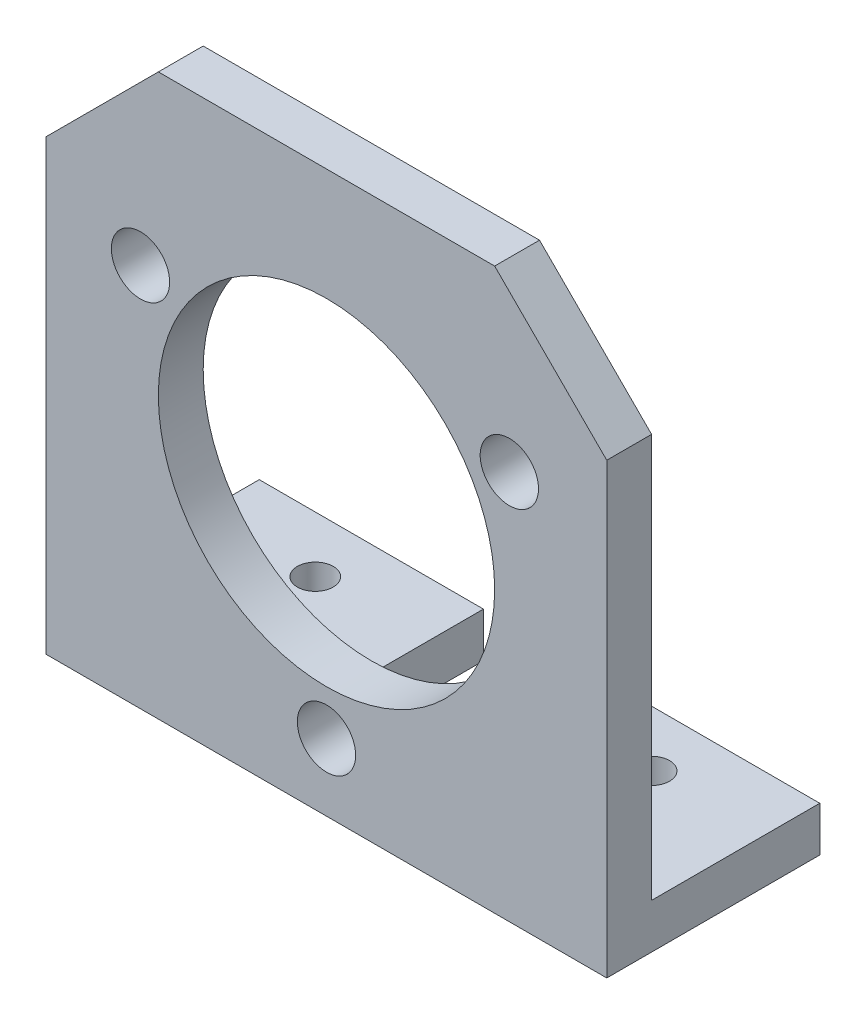
ISO-10303-21;
HEADER;
FILE_DESCRIPTION(('STEP AP214'),'2;1');
FILE_NAME('part.step','',(''),(''),'','','');
FILE_SCHEMA(('AUTOMOTIVE_DESIGN { 1 0 10303 214 1 1 1 1 }'));
ENDSEC;
DATA;
#1=APPLICATION_CONTEXT('core data for automotive mechanical design processes');
#2=APPLICATION_PROTOCOL_DEFINITION('international standard','automotive_design',2000,#1);
#3=PRODUCT_CONTEXT('',#1,'mechanical');
#4=PRODUCT('Part','Part','',(#3));
#5=PRODUCT_RELATED_PRODUCT_CATEGORY('part','',(#4));
#6=PRODUCT_DEFINITION_FORMATION('','',#4);
#7=PRODUCT_DEFINITION_CONTEXT('part definition',#1,'design');
#8=PRODUCT_DEFINITION('design','',#6,#7);
#9=PRODUCT_DEFINITION_SHAPE('','',#8);
#10=(LENGTH_UNIT() NAMED_UNIT(*) SI_UNIT(.MILLI.,.METRE.));
#11=(NAMED_UNIT(*) PLANE_ANGLE_UNIT() SI_UNIT($,.RADIAN.));
#12=(NAMED_UNIT(*) SI_UNIT($,.STERADIAN.) SOLID_ANGLE_UNIT());
#13=UNCERTAINTY_MEASURE_WITH_UNIT(LENGTH_MEASURE(1.E-05),#10,'distance_accuracy_value','');
#14=(GEOMETRIC_REPRESENTATION_CONTEXT(3) GLOBAL_UNCERTAINTY_ASSIGNED_CONTEXT((#13)) GLOBAL_UNIT_ASSIGNED_CONTEXT((#10,
#11,#12)) REPRESENTATION_CONTEXT('',''));
#15=CARTESIAN_POINT('',(0.,0.,0.));
#16=DIRECTION('',(0.,0.,1.));
#17=DIRECTION('',(1.,0.,0.));
#18=AXIS2_PLACEMENT_3D('',#15,#16,#17);
#19=CARTESIAN_POINT('',(0.,0.,0.));
#20=DIRECTION('',(0.,0.,1.));
#21=DIRECTION('',(1.,0.,0.));
#22=AXIS2_PLACEMENT_3D('',#19,#20,#21);
#23=PLANE('',#22);
#24=CARTESIAN_POINT('',(0.,-18.9999999999988,0.));
#25=DIRECTION('',(0.,0.,1.));
#26=DIRECTION('',(1.,0.,0.));
#27=AXIS2_PLACEMENT_3D('',#24,#25,#26);
#28=CIRCLE('',#27,2.60000000000016);
#29=CARTESIAN_POINT('',(2.60000000000016,-18.9999999999988,0.));
#30=VERTEX_POINT('',#29);
#31=EDGE_CURVE('E218',#30,#30,#28,.T.);
#32=ORIENTED_EDGE('',*,*,#31,.T.);
#33=EDGE_LOOP('',(#32));
#34=FACE_BOUND('',#33,.T.);
#35=CARTESIAN_POINT('',(16.3098829807149,9.74616422780983,0.));
#36=DIRECTION('',(0.,0.,1.));
#37=DIRECTION('',(1.,0.,0.));
#38=AXIS2_PLACEMENT_3D('',#35,#36,#37);
#39=CIRCLE('',#38,2.60000000000016);
#40=CARTESIAN_POINT('',(18.9098829807151,9.74616422780983,0.));
#41=VERTEX_POINT('',#40);
#42=EDGE_CURVE('E221',#41,#41,#39,.T.);
#43=ORIENTED_EDGE('',*,*,#42,.T.);
#44=EDGE_LOOP('',(#43));
#45=FACE_BOUND('',#44,.T.);
#46=CARTESIAN_POINT('',(-16.5929960471987,9.25594307338073,0.));
#47=DIRECTION('',(0.,0.,1.));
#48=DIRECTION('',(1.,0.,0.));
#49=AXIS2_PLACEMENT_3D('',#46,#47,#48);
#50=CIRCLE('',#49,2.60000000000016);
#51=CARTESIAN_POINT('',(-13.9929960471985,9.25594307338073,0.));
#52=VERTEX_POINT('',#51);
#53=EDGE_CURVE('E224',#52,#52,#50,.T.);
#54=ORIENTED_EDGE('',*,*,#53,.T.);
#55=EDGE_LOOP('',(#54));
#56=FACE_BOUND('',#55,.T.);
#57=CARTESIAN_POINT('',(0.,0.,0.));
#58=DIRECTION('',(0.,0.,1.));
#59=DIRECTION('',(1.,0.,0.));
#60=AXIS2_PLACEMENT_3D('',#57,#58,#59);
#61=CIRCLE('',#60,15.0000000000006);
#62=CARTESIAN_POINT('',(15.0000000000006,0.,0.));
#63=VERTEX_POINT('',#62);
#64=EDGE_CURVE('E181',#63,#63,#61,.T.);
#65=ORIENTED_EDGE('',*,*,#64,.T.);
#66=EDGE_LOOP('',(#65));
#67=FACE_BOUND('',#66,.T.);
#68=DIRECTION('',(0.,-1.,0.));
#69=VECTOR('',#68,1.);
#70=CARTESIAN_POINT('',(-4.99999999999989,-20.9999999999999,0.));
#71=LINE('',#70,#69);
#72=CARTESIAN_POINT('',(-4.99999999999989,-20.9999999999999,0.));
#73=VERTEX_POINT('',#72);
#74=CARTESIAN_POINT('',(-4.99999999999989,-24.9999999999999,0.));
#75=VERTEX_POINT('',#74);
#76=EDGE_CURVE('E148',#73,#75,#71,.T.);
#77=ORIENTED_EDGE('',*,*,#76,.F.);
#78=DIRECTION('',(1.,0.,0.));
#79=VECTOR('',#78,1.);
#80=CARTESIAN_POINT('',(-4.99999999999989,-20.9999999999999,0.));
#81=LINE('',#80,#79);
#82=CARTESIAN_POINT('',(-25.0000000000004,-20.9999999999999,0.));
#83=VERTEX_POINT('',#82);
#84=EDGE_CURVE('E144',#83,#73,#81,.T.);
#85=ORIENTED_EDGE('',*,*,#84,.F.);
#86=DIRECTION('',(0.,-1.,0.));
#87=VECTOR('',#86,1.);
#88=CARTESIAN_POINT('',(-25.0000000000004,0.,0.));
#89=LINE('',#88,#87);
#90=CARTESIAN_POINT('',(-25.0000000000004,14.9999999999997,0.));
#91=VERTEX_POINT('',#90);
#92=EDGE_CURVE('E215',#91,#83,#89,.T.);
#93=ORIENTED_EDGE('',*,*,#92,.F.);
#94=DIRECTION('',(-0.707106781186532,-0.707106781186563,0.));
#95=VECTOR('',#94,1.);
#96=CARTESIAN_POINT('',(-20.0000000000006,19.9999999999997,0.));
#97=LINE('',#96,#95);
#98=CARTESIAN_POINT('',(-15.0000000000006,24.9999999999999,0.));
#99=VERTEX_POINT('',#98);
#100=EDGE_CURVE('E213',#99,#91,#97,.T.);
#101=ORIENTED_EDGE('',*,*,#100,.F.);
#102=DIRECTION('',(1.,0.,0.));
#103=VECTOR('',#102,1.);
#104=CARTESIAN_POINT('',(0.,24.9999999999997,0.));
#105=LINE('',#104,#103);
#106=CARTESIAN_POINT('',(15.0000000000012,24.9999999999997,0.));
#107=VERTEX_POINT('',#106);
#108=EDGE_CURVE('E210',#99,#107,#105,.T.);
#109=ORIENTED_EDGE('',*,*,#108,.T.);
#110=DIRECTION('',(-0.707106781186548,0.707106781186548,0.));
#111=VECTOR('',#110,1.);
#112=CARTESIAN_POINT('',(20.0000000000005,20.0000000000005,0.));
#113=LINE('',#112,#111);
#114=CARTESIAN_POINT('',(25.0000000000019,14.999999999999,0.));
#115=VERTEX_POINT('',#114);
#116=EDGE_CURVE('E207',#115,#107,#113,.T.);
#117=ORIENTED_EDGE('',*,*,#116,.F.);
#118=DIRECTION('',(0.,-1.,0.));
#119=VECTOR('',#118,1.);
#120=CARTESIAN_POINT('',(25.0000000000019,0.,0.));
#121=LINE('',#120,#119);
#122=CARTESIAN_POINT('',(25.0000000000019,-20.9999999999999,0.));
#123=VERTEX_POINT('',#122);
#124=EDGE_CURVE('E51',#115,#123,#121,.T.);
#125=ORIENTED_EDGE('',*,*,#124,.T.);
#126=DIRECTION('',(1.,0.,0.));
#127=VECTOR('',#126,1.);
#128=CARTESIAN_POINT('',(25.0000000000004,-20.9999999999999,0.));
#129=LINE('',#128,#127);
#130=CARTESIAN_POINT('',(4.9999999999999,-20.9999999999999,0.));
#131=VERTEX_POINT('',#130);
#132=EDGE_CURVE('E153',#131,#123,#129,.T.);
#133=ORIENTED_EDGE('',*,*,#132,.F.);
#134=DIRECTION('',(0.,1.,0.));
#135=VECTOR('',#134,1.);
#136=CARTESIAN_POINT('',(4.9999999999999,-20.9999999999999,0.));
#137=LINE('',#136,#135);
#138=CARTESIAN_POINT('',(4.9999999999999,-24.9999999999999,0.));
#139=VERTEX_POINT('',#138);
#140=EDGE_CURVE('E149',#139,#131,#137,.T.);
#141=ORIENTED_EDGE('',*,*,#140,.F.);
#142=DIRECTION('',(1.,0.,0.));
#143=VECTOR('',#142,1.);
#144=CARTESIAN_POINT('',(0.,-24.9999999999999,0.));
#145=LINE('',#144,#143);
#146=EDGE_CURVE('E59',#75,#139,#145,.T.);
#147=ORIENTED_EDGE('',*,*,#146,.F.);
#148=EDGE_LOOP('',(#77,#85,#93,#101,#109,#117,#125,#133,#141,#147));
#149=FACE_BOUND('',#148,.T.);
#150=ADVANCED_FACE('F34',(#34,#45,#56,#67,#149),#23,.F.);
#151=CARTESIAN_POINT('',(0.,-24.9999999999999,4.));
#152=DIRECTION('',(0.,1.,0.));
#153=DIRECTION('',(0.,0.,1.));
#154=AXIS2_PLACEMENT_3D('',#151,#152,#153);
#155=PLANE('',#154);
#156=CARTESIAN_POINT('',(-15.0000000000004,-24.9999999999999,-9.99999999999999));
#157=DIRECTION('',(0.,-1.,0.));
#158=DIRECTION('',(0.,0.,-1.));
#159=AXIS2_PLACEMENT_3D('',#156,#157,#158);
#160=CIRCLE('',#159,1.6);
#161=CARTESIAN_POINT('',(-15.0000000000004,-24.9999999999999,-11.6));
#162=VERTEX_POINT('',#161);
#163=EDGE_CURVE('E248',#162,#162,#160,.T.);
#164=ORIENTED_EDGE('',*,*,#163,.F.);
#165=EDGE_LOOP('',(#164));
#166=FACE_BOUND('',#165,.T.);
#167=CARTESIAN_POINT('',(14.9999999999996,-24.9999999999999,-9.99999999999998));
#168=DIRECTION('',(0.,-1.,0.));
#169=DIRECTION('',(0.,0.,-1.));
#170=AXIS2_PLACEMENT_3D('',#167,#168,#169);
#171=CIRCLE('',#170,1.6);
#172=CARTESIAN_POINT('',(14.9999999999996,-24.9999999999999,-11.6));
#173=VERTEX_POINT('',#172);
#174=EDGE_CURVE('E239',#173,#173,#171,.T.);
#175=ORIENTED_EDGE('',*,*,#174,.F.);
#176=EDGE_LOOP('',(#175));
#177=FACE_BOUND('',#176,.T.);
#178=DIRECTION('',(0.,0.,-1.));
#179=VECTOR('',#178,1.);
#180=CARTESIAN_POINT('',(-25.0000000000004,-24.9999999999999,4.));
#181=LINE('',#180,#179);
#182=CARTESIAN_POINT('',(-25.0000000000004,-24.9999999999999,4.));
#183=VERTEX_POINT('',#182);
#184=CARTESIAN_POINT('',(-25.0000000000004,-24.9999999999999,-15.));
#185=VERTEX_POINT('',#184);
#186=EDGE_CURVE('E131',#183,#185,#181,.T.);
#187=ORIENTED_EDGE('',*,*,#186,.T.);
#188=DIRECTION('',(-1.,0.,0.));
#189=VECTOR('',#188,1.);
#190=CARTESIAN_POINT('',(-4.99999999999989,-24.9999999999999,-15.));
#191=LINE('',#190,#189);
#192=CARTESIAN_POINT('',(-4.99999999999989,-24.9999999999999,-15.));
#193=VERTEX_POINT('',#192);
#194=EDGE_CURVE('E124',#193,#185,#191,.T.);
#195=ORIENTED_EDGE('',*,*,#194,.F.);
#196=DIRECTION('',(0.,0.,1.));
#197=VECTOR('',#196,1.);
#198=CARTESIAN_POINT('',(-4.99999999999989,-24.9999999999999,-15.));
#199=LINE('',#198,#197);
#200=EDGE_CURVE('E127',#193,#75,#199,.T.);
#201=ORIENTED_EDGE('',*,*,#200,.T.);
#202=ORIENTED_EDGE('',*,*,#146,.T.);
#203=DIRECTION('',(0.,0.,1.));
#204=VECTOR('',#203,1.);
#205=CARTESIAN_POINT('',(4.99999999999989,-25.0000000000004,-15.));
#206=LINE('',#205,#204);
#207=CARTESIAN_POINT('',(4.99999999999989,-25.0000000000004,-15.));
#208=VERTEX_POINT('',#207);
#209=EDGE_CURVE('E175',#208,#139,#206,.T.);
#210=ORIENTED_EDGE('',*,*,#209,.F.);
#211=DIRECTION('',(-1.,0.,0.));
#212=VECTOR('',#211,1.);
#213=CARTESIAN_POINT('',(25.0000000000004,-24.9999999999999,-15.));
#214=LINE('',#213,#212);
#215=CARTESIAN_POINT('',(25.0000000000004,-24.9999999999999,-15.));
#216=VERTEX_POINT('',#215);
#217=EDGE_CURVE('E162',#216,#208,#214,.T.);
#218=ORIENTED_EDGE('',*,*,#217,.F.);
#219=DIRECTION('',(0.,0.,-1.));
#220=VECTOR('',#219,1.);
#221=CARTESIAN_POINT('',(25.0000000000019,-24.9999999999999,4.));
#222=LINE('',#221,#220);
#223=CARTESIAN_POINT('',(25.0000000000019,-24.9999999999999,4.));
#224=VERTEX_POINT('',#223);
#225=EDGE_CURVE('E11',#224,#216,#222,.T.);
#226=ORIENTED_EDGE('',*,*,#225,.F.);
#227=DIRECTION('',(1.,0.,0.));
#228=VECTOR('',#227,1.);
#229=CARTESIAN_POINT('',(0.,-24.9999999999999,4.));
#230=LINE('',#229,#228);
#231=EDGE_CURVE('E178',#183,#224,#230,.T.);
#232=ORIENTED_EDGE('',*,*,#231,.F.);
#233=EDGE_LOOP('',(#187,#195,#201,#202,#210,#218,#226,#232));
#234=FACE_BOUND('',#233,.T.);
#235=ADVANCED_FACE('F36',(#166,#177,#234),#155,.F.);
#236=CARTESIAN_POINT('',(25.0000000000019,0.,4.));
#237=DIRECTION('',(1.,0.,0.));
#238=DIRECTION('',(0.,0.,-1.));
#239=AXIS2_PLACEMENT_3D('',#236,#237,#238);
#240=PLANE('',#239);
#241=ORIENTED_EDGE('',*,*,#124,.F.);
#242=DIRECTION('',(0.,0.,-1.));
#243=VECTOR('',#242,1.);
#244=CARTESIAN_POINT('',(25.0000000000019,14.999999999999,4.));
#245=LINE('',#244,#243);
#246=CARTESIAN_POINT('',(25.0000000000019,14.999999999999,4.));
#247=VERTEX_POINT('',#246);
#248=EDGE_CURVE('E43',#247,#115,#245,.T.);
#249=ORIENTED_EDGE('',*,*,#248,.F.);
#250=DIRECTION('',(0.,-1.,0.));
#251=VECTOR('',#250,1.);
#252=CARTESIAN_POINT('',(25.0000000000019,0.,4.));
#253=LINE('',#252,#251);
#254=EDGE_CURVE('E180',#247,#224,#253,.T.);
#255=ORIENTED_EDGE('',*,*,#254,.T.);
#256=ORIENTED_EDGE('',*,*,#225,.T.);
#257=DIRECTION('',(0.,-1.,0.));
#258=VECTOR('',#257,1.);
#259=CARTESIAN_POINT('',(25.0000000000004,-20.9999999999995,-15.));
#260=LINE('',#259,#258);
#261=CARTESIAN_POINT('',(25.0000000000004,-20.9999999999995,-15.));
#262=VERTEX_POINT('',#261);
#263=EDGE_CURVE('E159',#262,#216,#260,.T.);
#264=ORIENTED_EDGE('',*,*,#263,.F.);
#265=DIRECTION('',(0.,0.,1.));
#266=VECTOR('',#265,1.);
#267=CARTESIAN_POINT('',(25.0000000000004,-20.9999999999995,-15.));
#268=LINE('',#267,#266);
#269=EDGE_CURVE('E167',#262,#123,#268,.T.);
#270=ORIENTED_EDGE('',*,*,#269,.T.);
#271=EDGE_LOOP('',(#241,#249,#255,#256,#264,#270));
#272=FACE_BOUND('',#271,.T.);
#273=ADVANCED_FACE('F268',(#272),#240,.T.);
#274=CARTESIAN_POINT('',(20.0000000000005,20.0000000000005,4.00000000000003));
#275=DIRECTION('',(-0.707106781186547,-0.707106781186547,0.));
#276=DIRECTION('',(0.707106781186548,-0.707106781186548,0.));
#277=AXIS2_PLACEMENT_3D('',#274,#275,#276);
#278=PLANE('',#277);
#279=ORIENTED_EDGE('',*,*,#116,.T.);
#280=DIRECTION('',(0.,0.,-1.));
#281=VECTOR('',#280,1.);
#282=CARTESIAN_POINT('',(15.0000000000012,24.9999999999997,4.00000000000001));
#283=LINE('',#282,#281);
#284=CARTESIAN_POINT('',(15.0000000000012,24.9999999999997,4.00000000000001));
#285=VERTEX_POINT('',#284);
#286=EDGE_CURVE('E235',#285,#107,#283,.T.);
#287=ORIENTED_EDGE('',*,*,#286,.F.);
#288=DIRECTION('',(-0.707106781186548,0.707106781186548,0.));
#289=VECTOR('',#288,1.);
#290=CARTESIAN_POINT('',(20.0000000000005,20.0000000000005,4.00000000000003));
#291=LINE('',#290,#289);
#292=EDGE_CURVE('E184',#247,#285,#291,.T.);
#293=ORIENTED_EDGE('',*,*,#292,.F.);
#294=ORIENTED_EDGE('',*,*,#248,.T.);
#295=EDGE_LOOP('',(#279,#287,#293,#294));
#296=FACE_BOUND('',#295,.T.);
#297=ADVANCED_FACE('F329',(#296),#278,.F.);
#298=CARTESIAN_POINT('',(0.,24.9999999999997,4.00000000000003));
#299=DIRECTION('',(0.,1.,0.));
#300=DIRECTION('',(0.,0.,1.));
#301=AXIS2_PLACEMENT_3D('',#298,#299,#300);
#302=PLANE('',#301);
#303=ORIENTED_EDGE('',*,*,#108,.F.);
#304=DIRECTION('',(0.,0.,-1.));
#305=VECTOR('',#304,1.);
#306=CARTESIAN_POINT('',(-15.0000000000006,24.9999999999999,4.));
#307=LINE('',#306,#305);
#308=CARTESIAN_POINT('',(-15.0000000000006,24.9999999999999,4.));
#309=VERTEX_POINT('',#308);
#310=EDGE_CURVE('E233',#309,#99,#307,.T.);
#311=ORIENTED_EDGE('',*,*,#310,.F.);
#312=DIRECTION('',(1.,0.,0.));
#313=VECTOR('',#312,1.);
#314=CARTESIAN_POINT('',(0.,24.9999999999997,4.00000000000003));
#315=LINE('',#314,#313);
#316=EDGE_CURVE('E186',#309,#285,#315,.T.);
#317=ORIENTED_EDGE('',*,*,#316,.T.);
#318=ORIENTED_EDGE('',*,*,#286,.T.);
#319=EDGE_LOOP('',(#303,#311,#317,#318));
#320=FACE_BOUND('',#319,.T.);
#321=ADVANCED_FACE('F325',(#320),#302,.T.);
#322=CARTESIAN_POINT('',(-20.0000000000006,19.9999999999997,4.));
#323=DIRECTION('',(0.707106781186563,-0.707106781186532,0.));
#324=DIRECTION('',(0.707106781186532,0.707106781186563,0.));
#325=AXIS2_PLACEMENT_3D('',#322,#323,#324);
#326=PLANE('',#325);
#327=ORIENTED_EDGE('',*,*,#100,.T.);
#328=DIRECTION('',(0.,0.,-1.));
#329=VECTOR('',#328,1.);
#330=CARTESIAN_POINT('',(-25.0000000000003,14.9999999999997,4.));
#331=LINE('',#330,#329);
#332=CARTESIAN_POINT('',(-25.0000000000003,14.9999999999997,4.));
#333=VERTEX_POINT('',#332);
#334=EDGE_CURVE('E230',#333,#91,#331,.T.);
#335=ORIENTED_EDGE('',*,*,#334,.F.);
#336=DIRECTION('',(-0.707106781186532,-0.707106781186563,0.));
#337=VECTOR('',#336,1.);
#338=CARTESIAN_POINT('',(-20.0000000000006,19.9999999999997,4.));
#339=LINE('',#338,#337);
#340=EDGE_CURVE('E189',#309,#333,#339,.T.);
#341=ORIENTED_EDGE('',*,*,#340,.F.);
#342=ORIENTED_EDGE('',*,*,#310,.T.);
#343=EDGE_LOOP('',(#327,#335,#341,#342));
#344=FACE_BOUND('',#343,.T.);
#345=ADVANCED_FACE('F312',(#344),#326,.F.);
#346=CARTESIAN_POINT('',(-16.5929960471986,9.25594307338073,4.00000000000003));
#347=DIRECTION('',(0.,0.,-1.));
#348=DIRECTION('',(-1.,0.,0.));
#349=AXIS2_PLACEMENT_3D('',#346,#347,#348);
#350=CYLINDRICAL_SURFACE('',#349,2.60000000000016);
#351=CARTESIAN_POINT('',(-16.5929960471986,9.25594307338073,4.00000000000003));
#352=DIRECTION('',(0.,0.,1.));
#353=DIRECTION('',(1.,0.,0.));
#354=AXIS2_PLACEMENT_3D('',#351,#352,#353);
#355=CIRCLE('',#354,2.60000000000016);
#356=CARTESIAN_POINT('',(-13.9929960471985,9.25594307338073,4.00000000000003));
#357=VERTEX_POINT('',#356);
#358=EDGE_CURVE('E199',#357,#357,#355,.T.);
#359=ORIENTED_EDGE('',*,*,#358,.T.);
#360=EDGE_LOOP('',(#359));
#361=FACE_BOUND('',#360,.T.);
#362=ORIENTED_EDGE('',*,*,#53,.F.);
#363=EDGE_LOOP('',(#362));
#364=FACE_BOUND('',#363,.T.);
#365=ADVANCED_FACE('F308',(#361,#364),#350,.F.);
#366=CARTESIAN_POINT('',(16.3098829807149,9.74616422780983,4.00000000000003));
#367=DIRECTION('',(0.,0.,-1.));
#368=DIRECTION('',(-1.,0.,0.));
#369=AXIS2_PLACEMENT_3D('',#366,#367,#368);
#370=CYLINDRICAL_SURFACE('',#369,2.60000000000016);
#371=CARTESIAN_POINT('',(16.3098829807149,9.74616422780983,4.00000000000003));
#372=DIRECTION('',(0.,0.,1.));
#373=DIRECTION('',(1.,0.,0.));
#374=AXIS2_PLACEMENT_3D('',#371,#372,#373);
#375=CIRCLE('',#374,2.60000000000016);
#376=CARTESIAN_POINT('',(18.9098829807151,9.74616422780983,4.00000000000003));
#377=VERTEX_POINT('',#376);
#378=EDGE_CURVE('E196',#377,#377,#375,.T.);
#379=ORIENTED_EDGE('',*,*,#378,.T.);
#380=EDGE_LOOP('',(#379));
#381=FACE_BOUND('',#380,.T.);
#382=ORIENTED_EDGE('',*,*,#42,.F.);
#383=EDGE_LOOP('',(#382));
#384=FACE_BOUND('',#383,.T.);
#385=ADVANCED_FACE('F311',(#381,#384),#370,.F.);
#386=CARTESIAN_POINT('',(0.,-18.9999999999988,4.00000000000003));
#387=DIRECTION('',(0.,0.,-1.));
#388=DIRECTION('',(-1.,0.,0.));
#389=AXIS2_PLACEMENT_3D('',#386,#387,#388);
#390=CYLINDRICAL_SURFACE('',#389,2.60000000000016);
#391=CARTESIAN_POINT('',(0.,-18.9999999999988,4.00000000000003));
#392=DIRECTION('',(0.,0.,1.));
#393=DIRECTION('',(1.,0.,0.));
#394=AXIS2_PLACEMENT_3D('',#391,#392,#393);
#395=CIRCLE('',#394,2.60000000000016);
#396=CARTESIAN_POINT('',(2.60000000000016,-18.9999999999988,4.00000000000003));
#397=VERTEX_POINT('',#396);
#398=EDGE_CURVE('E193',#397,#397,#395,.T.);
#399=ORIENTED_EDGE('',*,*,#398,.T.);
#400=EDGE_LOOP('',(#399));
#401=FACE_BOUND('',#400,.T.);
#402=ORIENTED_EDGE('',*,*,#31,.F.);
#403=EDGE_LOOP('',(#402));
#404=FACE_BOUND('',#403,.T.);
#405=ADVANCED_FACE('F316',(#401,#404),#390,.F.);
#406=CARTESIAN_POINT('',(-25.0000000000004,0.,4.));
#407=DIRECTION('',(1.,0.,0.));
#408=DIRECTION('',(0.,0.,-1.));
#409=AXIS2_PLACEMENT_3D('',#406,#407,#408);
#410=PLANE('',#409);
#411=ORIENTED_EDGE('',*,*,#92,.T.);
#412=DIRECTION('',(0.,0.,1.));
#413=VECTOR('',#412,1.);
#414=CARTESIAN_POINT('',(-25.0000000000004,-20.9999999999999,-15.));
#415=LINE('',#414,#413);
#416=CARTESIAN_POINT('',(-25.0000000000004,-20.9999999999999,-15.));
#417=VERTEX_POINT('',#416);
#418=EDGE_CURVE('E150',#417,#83,#415,.T.);
#419=ORIENTED_EDGE('',*,*,#418,.F.);
#420=DIRECTION('',(0.,1.,0.));
#421=VECTOR('',#420,1.);
#422=CARTESIAN_POINT('',(-25.0000000000004,-20.9999999999999,-15.));
#423=LINE('',#422,#421);
#424=EDGE_CURVE('E134',#185,#417,#423,.T.);
#425=ORIENTED_EDGE('',*,*,#424,.F.);
#426=ORIENTED_EDGE('',*,*,#186,.F.);
#427=DIRECTION('',(0.,-1.,0.));
#428=VECTOR('',#427,1.);
#429=CARTESIAN_POINT('',(-25.0000000000004,0.,4.));
#430=LINE('',#429,#428);
#431=EDGE_CURVE('E191',#333,#183,#430,.T.);
#432=ORIENTED_EDGE('',*,*,#431,.F.);
#433=ORIENTED_EDGE('',*,*,#334,.T.);
#434=EDGE_LOOP('',(#411,#419,#425,#426,#432,#433));
#435=FACE_BOUND('',#434,.T.);
#436=ADVANCED_FACE('F280',(#435),#410,.F.);
#437=CARTESIAN_POINT('',(0.,0.,4.));
#438=DIRECTION('',(0.,0.,-1.));
#439=DIRECTION('',(-1.,0.,0.));
#440=AXIS2_PLACEMENT_3D('',#437,#438,#439);
#441=CYLINDRICAL_SURFACE('',#440,15.0000000000006);
#442=CARTESIAN_POINT('',(0.,0.,4.));
#443=DIRECTION('',(0.,0.,1.));
#444=DIRECTION('',(1.,0.,0.));
#445=AXIS2_PLACEMENT_3D('',#442,#443,#444);
#446=CIRCLE('',#445,15.0000000000006);
#447=CARTESIAN_POINT('',(15.0000000000006,0.,4.));
#448=VERTEX_POINT('',#447);
#449=EDGE_CURVE('E202',#448,#448,#446,.T.);
#450=ORIENTED_EDGE('',*,*,#449,.T.);
#451=EDGE_LOOP('',(#450));
#452=FACE_BOUND('',#451,.T.);
#453=ORIENTED_EDGE('',*,*,#64,.F.);
#454=EDGE_LOOP('',(#453));
#455=FACE_BOUND('',#454,.T.);
#456=ADVANCED_FACE('F304',(#452,#455),#441,.F.);
#457=CARTESIAN_POINT('',(0.,0.,4.));
#458=DIRECTION('',(0.,0.,1.));
#459=DIRECTION('',(1.,0.,0.));
#460=AXIS2_PLACEMENT_3D('',#457,#458,#459);
#461=PLANE('',#460);
#462=ORIENTED_EDGE('',*,*,#231,.T.);
#463=ORIENTED_EDGE('',*,*,#254,.F.);
#464=ORIENTED_EDGE('',*,*,#292,.T.);
#465=ORIENTED_EDGE('',*,*,#316,.F.);
#466=ORIENTED_EDGE('',*,*,#340,.T.);
#467=ORIENTED_EDGE('',*,*,#431,.T.);
#468=EDGE_LOOP('',(#462,#463,#464,#465,#466,#467));
#469=FACE_BOUND('',#468,.T.);
#470=ORIENTED_EDGE('',*,*,#398,.F.);
#471=EDGE_LOOP('',(#470));
#472=FACE_BOUND('',#471,.T.);
#473=ORIENTED_EDGE('',*,*,#378,.F.);
#474=EDGE_LOOP('',(#473));
#475=FACE_BOUND('',#474,.T.);
#476=ORIENTED_EDGE('',*,*,#358,.F.);
#477=EDGE_LOOP('',(#476));
#478=FACE_BOUND('',#477,.T.);
#479=ORIENTED_EDGE('',*,*,#449,.F.);
#480=EDGE_LOOP('',(#479));
#481=FACE_BOUND('',#480,.T.);
#482=ADVANCED_FACE('F272',(#469,#472,#475,#478,#481),#461,.T.);
#483=CARTESIAN_POINT('',(4.99999999999989,-20.9999999999999,-15.));
#484=DIRECTION('',(1.,0.,0.));
#485=DIRECTION('',(0.,0.,-1.));
#486=AXIS2_PLACEMENT_3D('',#483,#484,#485);
#487=PLANE('',#486);
#488=ORIENTED_EDGE('',*,*,#140,.T.);
#489=DIRECTION('',(0.,0.,1.));
#490=VECTOR('',#489,1.);
#491=CARTESIAN_POINT('',(4.99999999999989,-20.9999999999999,-15.));
#492=LINE('',#491,#490);
#493=CARTESIAN_POINT('',(4.99999999999989,-20.9999999999999,-15.));
#494=VERTEX_POINT('',#493);
#495=EDGE_CURVE('E172',#494,#131,#492,.T.);
#496=ORIENTED_EDGE('',*,*,#495,.F.);
#497=DIRECTION('',(0.,1.,0.));
#498=VECTOR('',#497,1.);
#499=CARTESIAN_POINT('',(4.99999999999989,-20.9999999999999,-15.));
#500=LINE('',#499,#498);
#501=EDGE_CURVE('E164',#208,#494,#500,.T.);
#502=ORIENTED_EDGE('',*,*,#501,.F.);
#503=ORIENTED_EDGE('',*,*,#209,.T.);
#504=EDGE_LOOP('',(#488,#496,#502,#503));
#505=FACE_BOUND('',#504,.T.);
#506=ADVANCED_FACE('F259',(#505),#487,.F.);
#507=CARTESIAN_POINT('',(25.0000000000004,-20.9999999999995,-15.));
#508=DIRECTION('',(0.,-1.,0.));
#509=DIRECTION('',(0.,0.,-1.));
#510=AXIS2_PLACEMENT_3D('',#507,#508,#509);
#511=PLANE('',#510);
#512=CARTESIAN_POINT('',(14.9999999999996,-20.9999999999999,-9.99999999999999));
#513=DIRECTION('',(0.,-1.,0.));
#514=DIRECTION('',(0.,0.,-1.));
#515=AXIS2_PLACEMENT_3D('',#512,#513,#514);
#516=CIRCLE('',#515,1.6);
#517=CARTESIAN_POINT('',(14.9999999999996,-20.9999999999999,-11.6));
#518=VERTEX_POINT('',#517);
#519=EDGE_CURVE('E237',#518,#518,#516,.T.);
#520=ORIENTED_EDGE('',*,*,#519,.T.);
#521=EDGE_LOOP('',(#520));
#522=FACE_BOUND('',#521,.T.);
#523=ORIENTED_EDGE('',*,*,#132,.T.);
#524=ORIENTED_EDGE('',*,*,#269,.F.);
#525=DIRECTION('',(1.,0.,0.));
#526=VECTOR('',#525,1.);
#527=CARTESIAN_POINT('',(25.0000000000004,-20.9999999999995,-15.));
#528=LINE('',#527,#526);
#529=EDGE_CURVE('E166',#494,#262,#528,.T.);
#530=ORIENTED_EDGE('',*,*,#529,.F.);
#531=ORIENTED_EDGE('',*,*,#495,.T.);
#532=EDGE_LOOP('',(#523,#524,#530,#531));
#533=FACE_BOUND('',#532,.T.);
#534=ADVANCED_FACE('F381',(#522,#533),#511,.F.);
#535=CARTESIAN_POINT('',(0.,0.,-15.));
#536=DIRECTION('',(0.,0.,-1.));
#537=DIRECTION('',(-1.,0.,0.));
#538=AXIS2_PLACEMENT_3D('',#535,#536,#537);
#539=PLANE('',#538);
#540=ORIENTED_EDGE('',*,*,#263,.T.);
#541=ORIENTED_EDGE('',*,*,#217,.T.);
#542=ORIENTED_EDGE('',*,*,#501,.T.);
#543=ORIENTED_EDGE('',*,*,#529,.T.);
#544=EDGE_LOOP('',(#540,#541,#542,#543));
#545=FACE_BOUND('',#544,.T.);
#546=ADVANCED_FACE('F264',(#545),#539,.T.);
#547=CARTESIAN_POINT('',(-4.99999999999989,-20.9999999999999,-15.));
#548=DIRECTION('',(-1.,0.,0.));
#549=DIRECTION('',(0.,0.,1.));
#550=AXIS2_PLACEMENT_3D('',#547,#548,#549);
#551=PLANE('',#550);
#552=ORIENTED_EDGE('',*,*,#76,.T.);
#553=ORIENTED_EDGE('',*,*,#200,.F.);
#554=DIRECTION('',(0.,-1.,0.));
#555=VECTOR('',#554,1.);
#556=CARTESIAN_POINT('',(-4.99999999999989,-20.9999999999999,-15.));
#557=LINE('',#556,#555);
#558=CARTESIAN_POINT('',(-4.99999999999989,-20.9999999999999,-15.));
#559=VERTEX_POINT('',#558);
#560=EDGE_CURVE('E135',#559,#193,#557,.T.);
#561=ORIENTED_EDGE('',*,*,#560,.F.);
#562=DIRECTION('',(0.,0.,1.));
#563=VECTOR('',#562,1.);
#564=CARTESIAN_POINT('',(-4.99999999999989,-20.9999999999999,-15.));
#565=LINE('',#564,#563);
#566=EDGE_CURVE('E155',#559,#73,#565,.T.);
#567=ORIENTED_EDGE('',*,*,#566,.T.);
#568=EDGE_LOOP('',(#552,#553,#561,#567));
#569=FACE_BOUND('',#568,.T.);
#570=ADVANCED_FACE('F146',(#569),#551,.F.);
#571=CARTESIAN_POINT('',(-4.99999999999989,-20.9999999999999,-15.));
#572=DIRECTION('',(0.,-1.,0.));
#573=DIRECTION('',(0.,0.,-1.));
#574=AXIS2_PLACEMENT_3D('',#571,#572,#573);
#575=PLANE('',#574);
#576=CARTESIAN_POINT('',(-15.0000000000004,-20.9999999999999,-10.));
#577=DIRECTION('',(0.,-1.,0.));
#578=DIRECTION('',(0.,0.,-1.));
#579=AXIS2_PLACEMENT_3D('',#576,#577,#578);
#580=CIRCLE('',#579,1.6);
#581=CARTESIAN_POINT('',(-15.0000000000004,-20.9999999999999,-11.6));
#582=VERTEX_POINT('',#581);
#583=EDGE_CURVE('E38',#582,#582,#580,.T.);
#584=ORIENTED_EDGE('',*,*,#583,.T.);
#585=EDGE_LOOP('',(#584));
#586=FACE_BOUND('',#585,.T.);
#587=ORIENTED_EDGE('',*,*,#84,.T.);
#588=ORIENTED_EDGE('',*,*,#566,.F.);
#589=DIRECTION('',(1.,0.,0.));
#590=VECTOR('',#589,1.);
#591=CARTESIAN_POINT('',(-4.99999999999989,-20.9999999999999,-15.));
#592=LINE('',#591,#590);
#593=EDGE_CURVE('E140',#417,#559,#592,.T.);
#594=ORIENTED_EDGE('',*,*,#593,.F.);
#595=ORIENTED_EDGE('',*,*,#418,.T.);
#596=EDGE_LOOP('',(#587,#588,#594,#595));
#597=FACE_BOUND('',#596,.T.);
#598=ADVANCED_FACE('F282',(#586,#597),#575,.F.);
#599=CARTESIAN_POINT('',(0.,0.,-15.));
#600=DIRECTION('',(0.,0.,-1.));
#601=DIRECTION('',(-1.,0.,0.));
#602=AXIS2_PLACEMENT_3D('',#599,#600,#601);
#603=PLANE('',#602);
#604=ORIENTED_EDGE('',*,*,#560,.T.);
#605=ORIENTED_EDGE('',*,*,#194,.T.);
#606=ORIENTED_EDGE('',*,*,#424,.T.);
#607=ORIENTED_EDGE('',*,*,#593,.T.);
#608=EDGE_LOOP('',(#604,#605,#606,#607));
#609=FACE_BOUND('',#608,.T.);
#610=ADVANCED_FACE('F138',(#609),#603,.T.);
#611=CARTESIAN_POINT('',(14.9999999999996,-9.9999999999999,-9.99999999999998));
#612=DIRECTION('',(0.,-1.,0.));
#613=DIRECTION('',(0.,0.,-1.));
#614=AXIS2_PLACEMENT_3D('',#611,#612,#613);
#615=CYLINDRICAL_SURFACE('',#614,1.6);
#616=ORIENTED_EDGE('',*,*,#174,.T.);
#617=EDGE_LOOP('',(#616));
#618=FACE_BOUND('',#617,.T.);
#619=ORIENTED_EDGE('',*,*,#519,.F.);
#620=EDGE_LOOP('',(#619));
#621=FACE_BOUND('',#620,.T.);
#622=ADVANCED_FACE('F290',(#618,#621),#615,.F.);
#623=CARTESIAN_POINT('',(-15.0000000000004,-9.9999999999999,-9.99999999999999));
#624=DIRECTION('',(0.,-1.,0.));
#625=DIRECTION('',(0.,0.,-1.));
#626=AXIS2_PLACEMENT_3D('',#623,#624,#625);
#627=CYLINDRICAL_SURFACE('',#626,1.6);
#628=ORIENTED_EDGE('',*,*,#163,.T.);
#629=EDGE_LOOP('',(#628));
#630=FACE_BOUND('',#629,.T.);
#631=ORIENTED_EDGE('',*,*,#583,.F.);
#632=EDGE_LOOP('',(#631));
#633=FACE_BOUND('',#632,.T.);
#634=ADVANCED_FACE('F416',(#630,#633),#627,.F.);
#635=CLOSED_SHELL('',(#150,#235,#273,#297,#321,#345,#365,#385,#405,#436,#456,#482,#506,#534,
#546,#570,#598,#610,#622,#634));
#636=MANIFOLD_SOLID_BREP('B2',#635);
#637=ADVANCED_BREP_SHAPE_REPRESENTATION('',(#18,#636),#14);
#638=SHAPE_DEFINITION_REPRESENTATION(#9,#637);
ENDSEC;
END-ISO-10303-21;
